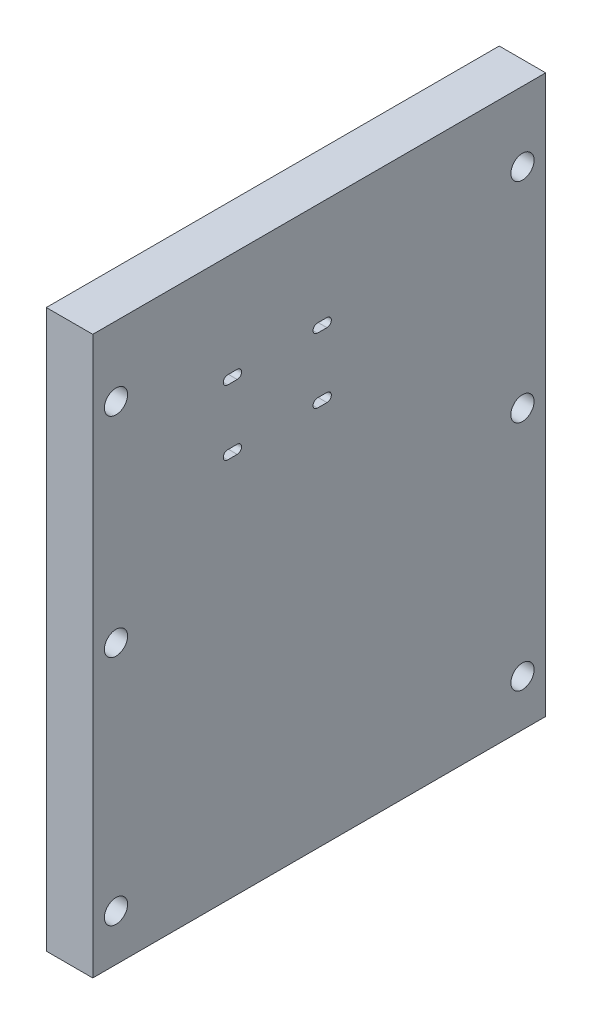
ISO-10303-21;
HEADER;
FILE_DESCRIPTION(('STEP AP214'),'2;1');
FILE_NAME('part.step','',(''),(''),'','','');
FILE_SCHEMA(('AUTOMOTIVE_DESIGN { 1 0 10303 214 1 1 1 1 }'));
ENDSEC;
DATA;
#1=APPLICATION_CONTEXT('core data for automotive mechanical design processes');
#2=APPLICATION_PROTOCOL_DEFINITION('international standard','automotive_design',2000,#1);
#3=PRODUCT_CONTEXT('',#1,'mechanical');
#4=PRODUCT('Part','Part','',(#3));
#5=PRODUCT_RELATED_PRODUCT_CATEGORY('part','',(#4));
#6=PRODUCT_DEFINITION_FORMATION('','',#4);
#7=PRODUCT_DEFINITION_CONTEXT('part definition',#1,'design');
#8=PRODUCT_DEFINITION('design','',#6,#7);
#9=PRODUCT_DEFINITION_SHAPE('','',#8);
#10=(LENGTH_UNIT() NAMED_UNIT(*) SI_UNIT(.MILLI.,.METRE.));
#11=(NAMED_UNIT(*) PLANE_ANGLE_UNIT() SI_UNIT($,.RADIAN.));
#12=(NAMED_UNIT(*) SI_UNIT($,.STERADIAN.) SOLID_ANGLE_UNIT());
#13=UNCERTAINTY_MEASURE_WITH_UNIT(LENGTH_MEASURE(1.E-05),#10,'distance_accuracy_value','');
#14=(GEOMETRIC_REPRESENTATION_CONTEXT(3) GLOBAL_UNCERTAINTY_ASSIGNED_CONTEXT((#13)) GLOBAL_UNIT_ASSIGNED_CONTEXT((#10,
#11,#12)) REPRESENTATION_CONTEXT('',''));
#15=CARTESIAN_POINT('',(0.,0.,0.));
#16=DIRECTION('',(0.,0.,1.));
#17=DIRECTION('',(1.,0.,0.));
#18=AXIS2_PLACEMENT_3D('',#15,#16,#17);
#19=CARTESIAN_POINT('',(12.7,46.97,-39.2012106466433));
#20=DIRECTION('',(-1.,0.,0.));
#21=DIRECTION('',(0.,0.,1.));
#22=AXIS2_PLACEMENT_3D('',#19,#20,#21);
#23=CYLINDRICAL_SURFACE('',#22,1.2);
#24=CARTESIAN_POINT('',(0.,46.97,-39.2012106466433));
#25=DIRECTION('',(1.,0.,0.));
#26=DIRECTION('',(0.,0.,-1.));
#27=AXIS2_PLACEMENT_3D('',#24,#25,#26);
#28=CIRCLE('',#27,1.2);
#29=CARTESIAN_POINT('',(0.,48.17,-39.2012106466433));
#30=VERTEX_POINT('',#29);
#31=CARTESIAN_POINT('',(0.,45.77,-39.2012106466433));
#32=VERTEX_POINT('',#31);
#33=EDGE_CURVE('E307',#30,#32,#28,.T.);
#34=ORIENTED_EDGE('',*,*,#33,.F.);
#35=DIRECTION('',(-1.,0.,0.));
#36=VECTOR('',#35,1.);
#37=CARTESIAN_POINT('',(12.7,48.17,-39.2012106466433));
#38=LINE('',#37,#36);
#39=CARTESIAN_POINT('',(12.7,48.17,-39.2012106466433));
#40=VERTEX_POINT('',#39);
#41=EDGE_CURVE('E11',#40,#30,#38,.T.);
#42=ORIENTED_EDGE('',*,*,#41,.F.);
#43=CARTESIAN_POINT('',(12.7,46.97,-39.2012106466433));
#44=DIRECTION('',(1.,0.,0.));
#45=DIRECTION('',(0.,0.,-1.));
#46=AXIS2_PLACEMENT_3D('',#43,#44,#45);
#47=CIRCLE('',#46,1.2);
#48=CARTESIAN_POINT('',(12.7,45.77,-39.2012106466433));
#49=VERTEX_POINT('',#48);
#50=EDGE_CURVE('E210',#40,#49,#47,.T.);
#51=ORIENTED_EDGE('',*,*,#50,.T.);
#52=DIRECTION('',(-1.,0.,0.));
#53=VECTOR('',#52,1.);
#54=CARTESIAN_POINT('',(12.7,45.77,-39.2012106466433));
#55=LINE('',#54,#53);
#56=EDGE_CURVE('E137',#49,#32,#55,.T.);
#57=ORIENTED_EDGE('',*,*,#56,.T.);
#58=EDGE_LOOP('',(#34,#42,#51,#57));
#59=FACE_BOUND('',#58,.T.);
#60=ADVANCED_FACE('F47',(#59),#23,.F.);
#61=CARTESIAN_POINT('',(12.7,48.17,0.));
#62=DIRECTION('',(0.,-1.,0.));
#63=DIRECTION('',(0.,0.,-1.));
#64=AXIS2_PLACEMENT_3D('',#61,#62,#63);
#65=PLANE('',#64);
#66=DIRECTION('',(0.,0.,1.));
#67=VECTOR('',#66,1.);
#68=CARTESIAN_POINT('',(0.,48.17,0.));
#69=LINE('',#68,#67);
#70=CARTESIAN_POINT('',(0.,48.17,-41.8012106466433));
#71=VERTEX_POINT('',#70);
#72=EDGE_CURVE('E201',#71,#30,#69,.T.);
#73=ORIENTED_EDGE('',*,*,#72,.F.);
#74=DIRECTION('',(-1.,0.,0.));
#75=VECTOR('',#74,1.);
#76=CARTESIAN_POINT('',(12.7,48.17,-41.8012106466433));
#77=LINE('',#76,#75);
#78=CARTESIAN_POINT('',(12.7,48.17,-41.8012106466433));
#79=VERTEX_POINT('',#78);
#80=EDGE_CURVE('E58',#79,#71,#77,.T.);
#81=ORIENTED_EDGE('',*,*,#80,.F.);
#82=DIRECTION('',(0.,0.,1.));
#83=VECTOR('',#82,1.);
#84=CARTESIAN_POINT('',(12.7,48.17,0.));
#85=LINE('',#84,#83);
#86=EDGE_CURVE('E199',#79,#40,#85,.T.);
#87=ORIENTED_EDGE('',*,*,#86,.T.);
#88=ORIENTED_EDGE('',*,*,#41,.T.);
#89=EDGE_LOOP('',(#73,#81,#87,#88));
#90=FACE_BOUND('',#89,.T.);
#91=ADVANCED_FACE('F198',(#90),#65,.T.);
#92=CARTESIAN_POINT('',(12.7,46.97,-41.8012106466433));
#93=DIRECTION('',(-1.,0.,0.));
#94=DIRECTION('',(0.,0.,1.));
#95=AXIS2_PLACEMENT_3D('',#92,#93,#94);
#96=CYLINDRICAL_SURFACE('',#95,1.2);
#97=CARTESIAN_POINT('',(0.,46.97,-41.8012106466433));
#98=DIRECTION('',(1.,0.,0.));
#99=DIRECTION('',(0.,0.,-1.));
#100=AXIS2_PLACEMENT_3D('',#97,#98,#99);
#101=CIRCLE('',#100,1.2);
#102=CARTESIAN_POINT('',(0.,45.77,-41.8012106466433));
#103=VERTEX_POINT('',#102);
#104=EDGE_CURVE('E313',#103,#71,#101,.T.);
#105=ORIENTED_EDGE('',*,*,#104,.F.);
#106=DIRECTION('',(-1.,0.,0.));
#107=VECTOR('',#106,1.);
#108=CARTESIAN_POINT('',(12.7,45.77,-41.8012106466433));
#109=LINE('',#108,#107);
#110=CARTESIAN_POINT('',(12.7,45.77,-41.8012106466433));
#111=VERTEX_POINT('',#110);
#112=EDGE_CURVE('E130',#111,#103,#109,.T.);
#113=ORIENTED_EDGE('',*,*,#112,.F.);
#114=CARTESIAN_POINT('',(12.7,46.97,-41.8012106466433));
#115=DIRECTION('',(1.,0.,0.));
#116=DIRECTION('',(0.,0.,-1.));
#117=AXIS2_PLACEMENT_3D('',#114,#115,#116);
#118=CIRCLE('',#117,1.2);
#119=EDGE_CURVE('E209',#111,#79,#118,.T.);
#120=ORIENTED_EDGE('',*,*,#119,.T.);
#121=ORIENTED_EDGE('',*,*,#80,.T.);
#122=EDGE_LOOP('',(#105,#113,#120,#121));
#123=FACE_BOUND('',#122,.T.);
#124=ADVANCED_FACE('F213',(#123),#96,.F.);
#125=CARTESIAN_POINT('',(12.7,30.43,0.));
#126=DIRECTION('',(0.,-1.,0.));
#127=DIRECTION('',(0.,0.,-1.));
#128=AXIS2_PLACEMENT_3D('',#125,#126,#127);
#129=PLANE('',#128);
#130=DIRECTION('',(0.,0.,1.));
#131=VECTOR('',#130,1.);
#132=CARTESIAN_POINT('',(0.,30.43,0.));
#133=LINE('',#132,#131);
#134=CARTESIAN_POINT('',(0.,30.43,-41.8012106466433));
#135=VERTEX_POINT('',#134);
#136=CARTESIAN_POINT('',(0.,30.43,-39.2012106466433));
#137=VERTEX_POINT('',#136);
#138=EDGE_CURVE('E291',#135,#137,#133,.T.);
#139=ORIENTED_EDGE('',*,*,#138,.F.);
#140=DIRECTION('',(-1.,0.,0.));
#141=VECTOR('',#140,1.);
#142=CARTESIAN_POINT('',(12.7,30.43,-41.8012106466433));
#143=LINE('',#142,#141);
#144=CARTESIAN_POINT('',(12.7,30.43,-41.8012106466433));
#145=VERTEX_POINT('',#144);
#146=EDGE_CURVE('E322',#145,#135,#143,.T.);
#147=ORIENTED_EDGE('',*,*,#146,.F.);
#148=DIRECTION('',(0.,0.,1.));
#149=VECTOR('',#148,1.);
#150=CARTESIAN_POINT('',(12.7,30.43,0.));
#151=LINE('',#150,#149);
#152=CARTESIAN_POINT('',(12.7,30.43,-39.2012106466433));
#153=VERTEX_POINT('',#152);
#154=EDGE_CURVE('E432',#145,#153,#151,.T.);
#155=ORIENTED_EDGE('',*,*,#154,.T.);
#156=DIRECTION('',(-1.,0.,0.));
#157=VECTOR('',#156,1.);
#158=CARTESIAN_POINT('',(12.7,30.43,-39.2012106466433));
#159=LINE('',#158,#157);
#160=EDGE_CURVE('E325',#153,#137,#159,.T.);
#161=ORIENTED_EDGE('',*,*,#160,.T.);
#162=EDGE_LOOP('',(#139,#147,#155,#161));
#163=FACE_BOUND('',#162,.T.);
#164=ADVANCED_FACE('F481',(#163),#129,.T.);
#165=CARTESIAN_POINT('',(12.7,29.23,-41.8012106466433));
#166=DIRECTION('',(-1.,0.,0.));
#167=DIRECTION('',(0.,0.,1.));
#168=AXIS2_PLACEMENT_3D('',#165,#166,#167);
#169=CYLINDRICAL_SURFACE('',#168,1.2);
#170=CARTESIAN_POINT('',(0.,29.23,-41.8012106466433));
#171=DIRECTION('',(1.,0.,0.));
#172=DIRECTION('',(0.,0.,-1.));
#173=AXIS2_PLACEMENT_3D('',#170,#171,#172);
#174=CIRCLE('',#173,1.2);
#175=CARTESIAN_POINT('',(0.,28.03,-41.8012106466433));
#176=VERTEX_POINT('',#175);
#177=EDGE_CURVE('E295',#135,#176,#174,.F.);
#178=ORIENTED_EDGE('',*,*,#177,.T.);
#179=DIRECTION('',(-1.,0.,0.));
#180=VECTOR('',#179,1.);
#181=CARTESIAN_POINT('',(12.7,28.03,-41.8012106466433));
#182=LINE('',#181,#180);
#183=CARTESIAN_POINT('',(12.7,28.03,-41.8012106466433));
#184=VERTEX_POINT('',#183);
#185=EDGE_CURVE('E333',#184,#176,#182,.T.);
#186=ORIENTED_EDGE('',*,*,#185,.F.);
#187=CARTESIAN_POINT('',(12.7,29.23,-41.8012106466433));
#188=DIRECTION('',(1.,0.,0.));
#189=DIRECTION('',(0.,0.,-1.));
#190=AXIS2_PLACEMENT_3D('',#187,#188,#189);
#191=CIRCLE('',#190,1.2);
#192=EDGE_CURVE('E436',#145,#184,#191,.F.);
#193=ORIENTED_EDGE('',*,*,#192,.F.);
#194=ORIENTED_EDGE('',*,*,#146,.T.);
#195=EDGE_LOOP('',(#178,#186,#193,#194));
#196=FACE_BOUND('',#195,.T.);
#197=ADVANCED_FACE('F477',(#196),#169,.F.);
#198=CARTESIAN_POINT('',(12.7,28.03,0.));
#199=DIRECTION('',(0.,-1.,0.));
#200=DIRECTION('',(0.,0.,-1.));
#201=AXIS2_PLACEMENT_3D('',#198,#199,#200);
#202=PLANE('',#201);
#203=DIRECTION('',(0.,0.,1.));
#204=VECTOR('',#203,1.);
#205=CARTESIAN_POINT('',(0.,28.03,0.));
#206=LINE('',#205,#204);
#207=CARTESIAN_POINT('',(0.,28.03,-39.2012106466433));
#208=VERTEX_POINT('',#207);
#209=EDGE_CURVE('E299',#176,#208,#206,.T.);
#210=ORIENTED_EDGE('',*,*,#209,.T.);
#211=DIRECTION('',(-1.,0.,0.));
#212=VECTOR('',#211,1.);
#213=CARTESIAN_POINT('',(12.7,28.03,-39.2012106466433));
#214=LINE('',#213,#212);
#215=CARTESIAN_POINT('',(12.7,28.03,-39.2012106466433));
#216=VERTEX_POINT('',#215);
#217=EDGE_CURVE('E328',#216,#208,#214,.T.);
#218=ORIENTED_EDGE('',*,*,#217,.F.);
#219=DIRECTION('',(0.,0.,1.));
#220=VECTOR('',#219,1.);
#221=CARTESIAN_POINT('',(12.7,28.03,0.));
#222=LINE('',#221,#220);
#223=EDGE_CURVE('E440',#184,#216,#222,.T.);
#224=ORIENTED_EDGE('',*,*,#223,.F.);
#225=ORIENTED_EDGE('',*,*,#185,.T.);
#226=EDGE_LOOP('',(#210,#218,#224,#225));
#227=FACE_BOUND('',#226,.T.);
#228=ADVANCED_FACE('F473',(#227),#202,.F.);
#229=CARTESIAN_POINT('',(12.7,45.77,0.));
#230=DIRECTION('',(0.,1.,0.));
#231=DIRECTION('',(0.,0.,1.));
#232=AXIS2_PLACEMENT_3D('',#229,#230,#231);
#233=PLANE('',#232);
#234=DIRECTION('',(0.,0.,-1.));
#235=VECTOR('',#234,1.);
#236=CARTESIAN_POINT('',(0.,45.77,0.));
#237=LINE('',#236,#235);
#238=CARTESIAN_POINT('',(0.,45.77,-14.6612106466434));
#239=VERTEX_POINT('',#238);
#240=CARTESIAN_POINT('',(0.,45.77,-17.2612106466434));
#241=VERTEX_POINT('',#240);
#242=EDGE_CURVE('E275',#239,#241,#237,.T.);
#243=ORIENTED_EDGE('',*,*,#242,.F.);
#244=DIRECTION('',(-1.,0.,0.));
#245=VECTOR('',#244,1.);
#246=CARTESIAN_POINT('',(12.7,45.77,-14.6612106466434));
#247=LINE('',#246,#245);
#248=CARTESIAN_POINT('',(12.7,45.77,-14.6612106466434));
#249=VERTEX_POINT('',#248);
#250=EDGE_CURVE('E329',#249,#239,#247,.T.);
#251=ORIENTED_EDGE('',*,*,#250,.F.);
#252=DIRECTION('',(0.,0.,-1.));
#253=VECTOR('',#252,1.);
#254=CARTESIAN_POINT('',(12.7,45.77,0.));
#255=LINE('',#254,#253);
#256=CARTESIAN_POINT('',(12.7,45.77,-17.2612106466434));
#257=VERTEX_POINT('',#256);
#258=EDGE_CURVE('E417',#249,#257,#255,.T.);
#259=ORIENTED_EDGE('',*,*,#258,.T.);
#260=DIRECTION('',(-1.,0.,0.));
#261=VECTOR('',#260,1.);
#262=CARTESIAN_POINT('',(12.7,45.77,-17.2612106466434));
#263=LINE('',#262,#261);
#264=EDGE_CURVE('E339',#257,#241,#263,.T.);
#265=ORIENTED_EDGE('',*,*,#264,.T.);
#266=EDGE_LOOP('',(#243,#251,#259,#265));
#267=FACE_BOUND('',#266,.T.);
#268=ADVANCED_FACE('F476',(#267),#233,.T.);
#269=CARTESIAN_POINT('',(12.7,46.97,-14.6612106466434));
#270=DIRECTION('',(-1.,0.,0.));
#271=DIRECTION('',(0.,0.,1.));
#272=AXIS2_PLACEMENT_3D('',#269,#270,#271);
#273=CYLINDRICAL_SURFACE('',#272,1.2);
#274=CARTESIAN_POINT('',(0.,46.97,-14.6612106466434));
#275=DIRECTION('',(1.,0.,0.));
#276=DIRECTION('',(0.,0.,-1.));
#277=AXIS2_PLACEMENT_3D('',#274,#275,#276);
#278=CIRCLE('',#277,1.2);
#279=CARTESIAN_POINT('',(0.,48.17,-14.6612106466434));
#280=VERTEX_POINT('',#279);
#281=EDGE_CURVE('E279',#239,#280,#278,.F.);
#282=ORIENTED_EDGE('',*,*,#281,.T.);
#283=DIRECTION('',(-1.,0.,0.));
#284=VECTOR('',#283,1.);
#285=CARTESIAN_POINT('',(12.7,48.17,-14.6612106466434));
#286=LINE('',#285,#284);
#287=CARTESIAN_POINT('',(12.7,48.17,-14.6612106466434));
#288=VERTEX_POINT('',#287);
#289=EDGE_CURVE('E347',#288,#280,#286,.T.);
#290=ORIENTED_EDGE('',*,*,#289,.F.);
#291=CARTESIAN_POINT('',(12.7,46.97,-14.6612106466434));
#292=DIRECTION('',(1.,0.,0.));
#293=DIRECTION('',(0.,0.,-1.));
#294=AXIS2_PLACEMENT_3D('',#291,#292,#293);
#295=CIRCLE('',#294,1.2);
#296=EDGE_CURVE('E421',#249,#288,#295,.F.);
#297=ORIENTED_EDGE('',*,*,#296,.F.);
#298=ORIENTED_EDGE('',*,*,#250,.T.);
#299=EDGE_LOOP('',(#282,#290,#297,#298));
#300=FACE_BOUND('',#299,.T.);
#301=ADVANCED_FACE('F494',(#300),#273,.F.);
#302=CARTESIAN_POINT('',(12.7,48.17,0.));
#303=DIRECTION('',(0.,1.,0.));
#304=DIRECTION('',(0.,0.,1.));
#305=AXIS2_PLACEMENT_3D('',#302,#303,#304);
#306=PLANE('',#305);
#307=DIRECTION('',(0.,0.,-1.));
#308=VECTOR('',#307,1.);
#309=CARTESIAN_POINT('',(0.,48.17,0.));
#310=LINE('',#309,#308);
#311=CARTESIAN_POINT('',(0.,48.17,-17.2612106466434));
#312=VERTEX_POINT('',#311);
#313=EDGE_CURVE('E283',#280,#312,#310,.T.);
#314=ORIENTED_EDGE('',*,*,#313,.T.);
#315=DIRECTION('',(-1.,0.,0.));
#316=VECTOR('',#315,1.);
#317=CARTESIAN_POINT('',(12.7,48.17,-17.2612106466434));
#318=LINE('',#317,#316);
#319=CARTESIAN_POINT('',(12.7,48.17,-17.2612106466434));
#320=VERTEX_POINT('',#319);
#321=EDGE_CURVE('E342',#320,#312,#318,.T.);
#322=ORIENTED_EDGE('',*,*,#321,.F.);
#323=DIRECTION('',(0.,0.,-1.));
#324=VECTOR('',#323,1.);
#325=CARTESIAN_POINT('',(12.7,48.17,0.));
#326=LINE('',#325,#324);
#327=EDGE_CURVE('E425',#288,#320,#326,.T.);
#328=ORIENTED_EDGE('',*,*,#327,.F.);
#329=ORIENTED_EDGE('',*,*,#289,.T.);
#330=EDGE_LOOP('',(#314,#322,#328,#329));
#331=FACE_BOUND('',#330,.T.);
#332=ADVANCED_FACE('F490',(#331),#306,.F.);
#333=CARTESIAN_POINT('',(12.7,29.23,-17.2612106466435));
#334=DIRECTION('',(-1.,0.,0.));
#335=DIRECTION('',(0.,0.,1.));
#336=AXIS2_PLACEMENT_3D('',#333,#334,#335);
#337=CYLINDRICAL_SURFACE('',#336,1.2);
#338=CARTESIAN_POINT('',(0.,29.23,-17.2612106466435));
#339=DIRECTION('',(1.,0.,0.));
#340=DIRECTION('',(0.,0.,-1.));
#341=AXIS2_PLACEMENT_3D('',#338,#339,#340);
#342=CIRCLE('',#341,1.2);
#343=CARTESIAN_POINT('',(0.,28.03,-17.2612106466434));
#344=VERTEX_POINT('',#343);
#345=CARTESIAN_POINT('',(0.,30.43,-17.2612106466434));
#346=VERTEX_POINT('',#345);
#347=EDGE_CURVE('E259',#344,#346,#342,.T.);
#348=ORIENTED_EDGE('',*,*,#347,.F.);
#349=DIRECTION('',(-1.,0.,0.));
#350=VECTOR('',#349,1.);
#351=CARTESIAN_POINT('',(12.7,28.03,-17.2612106466434));
#352=LINE('',#351,#350);
#353=CARTESIAN_POINT('',(12.7,28.03,-17.2612106466434));
#354=VERTEX_POINT('',#353);
#355=EDGE_CURVE('E343',#354,#344,#352,.T.);
#356=ORIENTED_EDGE('',*,*,#355,.F.);
#357=CARTESIAN_POINT('',(12.7,29.23,-17.2612106466435));
#358=DIRECTION('',(1.,0.,0.));
#359=DIRECTION('',(0.,0.,-1.));
#360=AXIS2_PLACEMENT_3D('',#357,#358,#359);
#361=CIRCLE('',#360,1.2);
#362=CARTESIAN_POINT('',(12.7,30.43,-17.2612106466434));
#363=VERTEX_POINT('',#362);
#364=EDGE_CURVE('E396',#354,#363,#361,.T.);
#365=ORIENTED_EDGE('',*,*,#364,.T.);
#366=DIRECTION('',(-1.,0.,0.));
#367=VECTOR('',#366,1.);
#368=CARTESIAN_POINT('',(12.7,30.43,-17.2612106466434));
#369=LINE('',#368,#367);
#370=EDGE_CURVE('E353',#363,#346,#369,.T.);
#371=ORIENTED_EDGE('',*,*,#370,.T.);
#372=EDGE_LOOP('',(#348,#356,#365,#371));
#373=FACE_BOUND('',#372,.T.);
#374=ADVANCED_FACE('F493',(#373),#337,.F.);
#375=CARTESIAN_POINT('',(12.7,28.03,0.));
#376=DIRECTION('',(0.,1.,0.));
#377=DIRECTION('',(0.,0.,1.));
#378=AXIS2_PLACEMENT_3D('',#375,#376,#377);
#379=PLANE('',#378);
#380=DIRECTION('',(0.,0.,-1.));
#381=VECTOR('',#380,1.);
#382=CARTESIAN_POINT('',(0.,28.03,0.));
#383=LINE('',#382,#381);
#384=CARTESIAN_POINT('',(0.,28.03,-14.6612106466434));
#385=VERTEX_POINT('',#384);
#386=EDGE_CURVE('E263',#385,#344,#383,.T.);
#387=ORIENTED_EDGE('',*,*,#386,.F.);
#388=DIRECTION('',(-1.,0.,0.));
#389=VECTOR('',#388,1.);
#390=CARTESIAN_POINT('',(12.7,28.03,-14.6612106466434));
#391=LINE('',#390,#389);
#392=CARTESIAN_POINT('',(12.7,28.03,-14.6612106466434));
#393=VERTEX_POINT('',#392);
#394=EDGE_CURVE('E359',#393,#385,#391,.T.);
#395=ORIENTED_EDGE('',*,*,#394,.F.);
#396=DIRECTION('',(0.,0.,-1.));
#397=VECTOR('',#396,1.);
#398=CARTESIAN_POINT('',(12.7,28.03,0.));
#399=LINE('',#398,#397);
#400=EDGE_CURVE('E402',#393,#354,#399,.T.);
#401=ORIENTED_EDGE('',*,*,#400,.T.);
#402=ORIENTED_EDGE('',*,*,#355,.T.);
#403=EDGE_LOOP('',(#387,#395,#401,#402));
#404=FACE_BOUND('',#403,.T.);
#405=ADVANCED_FACE('F508',(#404),#379,.T.);
#406=CARTESIAN_POINT('',(12.7,29.23,-14.6612106466434));
#407=DIRECTION('',(-1.,0.,0.));
#408=DIRECTION('',(0.,0.,1.));
#409=AXIS2_PLACEMENT_3D('',#406,#407,#408);
#410=CYLINDRICAL_SURFACE('',#409,1.2);
#411=CARTESIAN_POINT('',(0.,29.23,-14.6612106466434));
#412=DIRECTION('',(1.,0.,0.));
#413=DIRECTION('',(0.,0.,-1.));
#414=AXIS2_PLACEMENT_3D('',#411,#412,#413);
#415=CIRCLE('',#414,1.2);
#416=CARTESIAN_POINT('',(0.,30.43,-14.6612106466434));
#417=VERTEX_POINT('',#416);
#418=EDGE_CURVE('E267',#417,#385,#415,.T.);
#419=ORIENTED_EDGE('',*,*,#418,.F.);
#420=DIRECTION('',(-1.,0.,0.));
#421=VECTOR('',#420,1.);
#422=CARTESIAN_POINT('',(12.7,30.43,-14.6612106466434));
#423=LINE('',#422,#421);
#424=CARTESIAN_POINT('',(12.7,30.43,-14.6612106466434));
#425=VERTEX_POINT('',#424);
#426=EDGE_CURVE('E356',#425,#417,#423,.T.);
#427=ORIENTED_EDGE('',*,*,#426,.F.);
#428=CARTESIAN_POINT('',(12.7,29.23,-14.6612106466434));
#429=DIRECTION('',(1.,0.,0.));
#430=DIRECTION('',(0.,0.,-1.));
#431=AXIS2_PLACEMENT_3D('',#428,#429,#430);
#432=CIRCLE('',#431,1.2);
#433=EDGE_CURVE('E410',#425,#393,#432,.T.);
#434=ORIENTED_EDGE('',*,*,#433,.T.);
#435=ORIENTED_EDGE('',*,*,#394,.T.);
#436=EDGE_LOOP('',(#419,#427,#434,#435));
#437=FACE_BOUND('',#436,.T.);
#438=ADVANCED_FACE('F505',(#437),#410,.F.);
#439=CARTESIAN_POINT('',(12.7,0.,-101.6));
#440=DIRECTION('',(0.,0.,1.));
#441=DIRECTION('',(1.,0.,0.));
#442=AXIS2_PLACEMENT_3D('',#439,#440,#441);
#443=PLANE('',#442);
#444=DIRECTION('',(0.,1.,0.));
#445=VECTOR('',#444,1.);
#446=CARTESIAN_POINT('',(0.,0.,-101.6));
#447=LINE('',#446,#445);
#448=CARTESIAN_POINT('',(0.,-76.2,-101.6));
#449=VERTEX_POINT('',#448);
#450=CARTESIAN_POINT('',(0.,76.2,-101.6));
#451=VERTEX_POINT('',#450);
#452=EDGE_CURVE('E245',#449,#451,#447,.T.);
#453=ORIENTED_EDGE('',*,*,#452,.T.);
#454=DIRECTION('',(-1.,0.,0.));
#455=VECTOR('',#454,1.);
#456=CARTESIAN_POINT('',(12.7,76.2,-101.6));
#457=LINE('',#456,#455);
#458=CARTESIAN_POINT('',(12.7,76.2,-101.6));
#459=VERTEX_POINT('',#458);
#460=EDGE_CURVE('E51',#459,#451,#457,.T.);
#461=ORIENTED_EDGE('',*,*,#460,.F.);
#462=DIRECTION('',(0.,1.,0.));
#463=VECTOR('',#462,1.);
#464=CARTESIAN_POINT('',(12.7,0.,-101.6));
#465=LINE('',#464,#463);
#466=CARTESIAN_POINT('',(12.7,-76.2,-101.6));
#467=VERTEX_POINT('',#466);
#468=EDGE_CURVE('E145',#467,#459,#465,.T.);
#469=ORIENTED_EDGE('',*,*,#468,.F.);
#470=DIRECTION('',(-1.,0.,0.));
#471=VECTOR('',#470,1.);
#472=CARTESIAN_POINT('',(12.7,-76.2,-101.6));
#473=LINE('',#472,#471);
#474=EDGE_CURVE('E217',#467,#449,#473,.T.);
#475=ORIENTED_EDGE('',*,*,#474,.T.);
#476=EDGE_LOOP('',(#453,#461,#469,#475));
#477=FACE_BOUND('',#476,.T.);
#478=ADVANCED_FACE('F383',(#477),#443,.F.);
#479=CARTESIAN_POINT('',(12.7,76.2,0.));
#480=DIRECTION('',(0.,1.,0.));
#481=DIRECTION('',(0.,0.,1.));
#482=AXIS2_PLACEMENT_3D('',#479,#480,#481);
#483=PLANE('',#482);
#484=DIRECTION('',(0.,0.,-1.));
#485=VECTOR('',#484,1.);
#486=CARTESIAN_POINT('',(0.,76.2,0.));
#487=LINE('',#486,#485);
#488=CARTESIAN_POINT('',(0.,76.2,22.225));
#489=VERTEX_POINT('',#488);
#490=EDGE_CURVE('E249',#489,#451,#487,.T.);
#491=ORIENTED_EDGE('',*,*,#490,.F.);
#492=DIRECTION('',(-1.,0.,0.));
#493=VECTOR('',#492,1.);
#494=CARTESIAN_POINT('',(12.7,76.2,22.225));
#495=LINE('',#494,#493);
#496=CARTESIAN_POINT('',(12.7,76.2,22.225));
#497=VERTEX_POINT('',#496);
#498=EDGE_CURVE('E370',#497,#489,#495,.T.);
#499=ORIENTED_EDGE('',*,*,#498,.F.);
#500=DIRECTION('',(0.,0.,-1.));
#501=VECTOR('',#500,1.);
#502=CARTESIAN_POINT('',(12.7,76.2,0.));
#503=LINE('',#502,#501);
#504=EDGE_CURVE('E380',#497,#459,#503,.T.);
#505=ORIENTED_EDGE('',*,*,#504,.T.);
#506=ORIENTED_EDGE('',*,*,#460,.T.);
#507=EDGE_LOOP('',(#491,#499,#505,#506));
#508=FACE_BOUND('',#507,.T.);
#509=ADVANCED_FACE('F379',(#508),#483,.T.);
#510=CARTESIAN_POINT('',(12.7,0.,22.225));
#511=DIRECTION('',(0.,0.,-1.));
#512=DIRECTION('',(-1.,0.,0.));
#513=AXIS2_PLACEMENT_3D('',#510,#511,#512);
#514=PLANE('',#513);
#515=DIRECTION('',(0.,-1.,0.));
#516=VECTOR('',#515,1.);
#517=CARTESIAN_POINT('',(0.,0.,22.225));
#518=LINE('',#517,#516);
#519=CARTESIAN_POINT('',(0.,-76.2,22.225));
#520=VERTEX_POINT('',#519);
#521=EDGE_CURVE('E253',#489,#520,#518,.T.);
#522=ORIENTED_EDGE('',*,*,#521,.T.);
#523=DIRECTION('',(-1.,0.,0.));
#524=VECTOR('',#523,1.);
#525=CARTESIAN_POINT('',(12.7,-76.2,22.225));
#526=LINE('',#525,#524);
#527=CARTESIAN_POINT('',(12.7,-76.2,22.225));
#528=VERTEX_POINT('',#527);
#529=EDGE_CURVE('E367',#528,#520,#526,.T.);
#530=ORIENTED_EDGE('',*,*,#529,.F.);
#531=DIRECTION('',(0.,-1.,0.));
#532=VECTOR('',#531,1.);
#533=CARTESIAN_POINT('',(12.7,0.,22.225));
#534=LINE('',#533,#532);
#535=EDGE_CURVE('E397',#497,#528,#534,.T.);
#536=ORIENTED_EDGE('',*,*,#535,.F.);
#537=ORIENTED_EDGE('',*,*,#498,.T.);
#538=EDGE_LOOP('',(#522,#530,#536,#537));
#539=FACE_BOUND('',#538,.T.);
#540=ADVANCED_FACE('F390',(#539),#514,.F.);
#541=CARTESIAN_POINT('',(12.7,29.23,-39.2012106466432));
#542=DIRECTION('',(-1.,0.,0.));
#543=DIRECTION('',(0.,0.,1.));
#544=AXIS2_PLACEMENT_3D('',#541,#542,#543);
#545=CYLINDRICAL_SURFACE('',#544,1.2);
#546=CARTESIAN_POINT('',(0.,29.23,-39.2012106466432));
#547=DIRECTION('',(1.,0.,0.));
#548=DIRECTION('',(0.,0.,-1.));
#549=AXIS2_PLACEMENT_3D('',#546,#547,#548);
#550=CIRCLE('',#549,1.2);
#551=EDGE_CURVE('E303',#208,#137,#550,.F.);
#552=ORIENTED_EDGE('',*,*,#551,.T.);
#553=ORIENTED_EDGE('',*,*,#160,.F.);
#554=CARTESIAN_POINT('',(12.7,29.23,-39.2012106466432));
#555=DIRECTION('',(1.,0.,0.));
#556=DIRECTION('',(0.,0.,-1.));
#557=AXIS2_PLACEMENT_3D('',#554,#555,#556);
#558=CIRCLE('',#557,1.2);
#559=EDGE_CURVE('E444',#216,#153,#558,.F.);
#560=ORIENTED_EDGE('',*,*,#559,.F.);
#561=ORIENTED_EDGE('',*,*,#217,.T.);
#562=EDGE_LOOP('',(#552,#553,#560,#561));
#563=FACE_BOUND('',#562,.T.);
#564=ADVANCED_FACE('F468',(#563),#545,.F.);
#565=CARTESIAN_POINT('',(12.7,46.97,-17.2612106466434));
#566=DIRECTION('',(-1.,0.,0.));
#567=DIRECTION('',(0.,0.,1.));
#568=AXIS2_PLACEMENT_3D('',#565,#566,#567);
#569=CYLINDRICAL_SURFACE('',#568,1.2);
#570=CARTESIAN_POINT('',(0.,46.97,-17.2612106466434));
#571=DIRECTION('',(1.,0.,0.));
#572=DIRECTION('',(0.,0.,-1.));
#573=AXIS2_PLACEMENT_3D('',#570,#571,#572);
#574=CIRCLE('',#573,1.2);
#575=EDGE_CURVE('E287',#312,#241,#574,.F.);
#576=ORIENTED_EDGE('',*,*,#575,.T.);
#577=ORIENTED_EDGE('',*,*,#264,.F.);
#578=CARTESIAN_POINT('',(12.7,46.97,-17.2612106466434));
#579=DIRECTION('',(1.,0.,0.));
#580=DIRECTION('',(0.,0.,-1.));
#581=AXIS2_PLACEMENT_3D('',#578,#579,#580);
#582=CIRCLE('',#581,1.2);
#583=EDGE_CURVE('E429',#320,#257,#582,.F.);
#584=ORIENTED_EDGE('',*,*,#583,.F.);
#585=ORIENTED_EDGE('',*,*,#321,.T.);
#586=EDGE_LOOP('',(#576,#577,#584,#585));
#587=FACE_BOUND('',#586,.T.);
#588=ADVANCED_FACE('F471',(#587),#569,.F.);
#589=CARTESIAN_POINT('',(12.7,30.43,0.));
#590=DIRECTION('',(0.,1.,0.));
#591=DIRECTION('',(0.,0.,1.));
#592=AXIS2_PLACEMENT_3D('',#589,#590,#591);
#593=PLANE('',#592);
#594=DIRECTION('',(0.,0.,-1.));
#595=VECTOR('',#594,1.);
#596=CARTESIAN_POINT('',(0.,30.43,0.));
#597=LINE('',#596,#595);
#598=EDGE_CURVE('E271',#417,#346,#597,.T.);
#599=ORIENTED_EDGE('',*,*,#598,.T.);
#600=ORIENTED_EDGE('',*,*,#370,.F.);
#601=DIRECTION('',(0.,0.,-1.));
#602=VECTOR('',#601,1.);
#603=CARTESIAN_POINT('',(12.7,30.43,0.));
#604=LINE('',#603,#602);
#605=EDGE_CURVE('E414',#425,#363,#604,.T.);
#606=ORIENTED_EDGE('',*,*,#605,.F.);
#607=ORIENTED_EDGE('',*,*,#426,.T.);
#608=EDGE_LOOP('',(#599,#600,#606,#607));
#609=FACE_BOUND('',#608,.T.);
#610=ADVANCED_FACE('F488',(#609),#593,.F.);
#611=CARTESIAN_POINT('',(12.7,-76.2,0.));
#612=DIRECTION('',(0.,1.,0.));
#613=DIRECTION('',(0.,0.,1.));
#614=AXIS2_PLACEMENT_3D('',#611,#612,#613);
#615=PLANE('',#614);
#616=DIRECTION('',(0.,0.,-1.));
#617=VECTOR('',#616,1.);
#618=CARTESIAN_POINT('',(0.,-76.2,0.));
#619=LINE('',#618,#617);
#620=EDGE_CURVE('E256',#520,#449,#619,.T.);
#621=ORIENTED_EDGE('',*,*,#620,.T.);
#622=ORIENTED_EDGE('',*,*,#474,.F.);
#623=DIRECTION('',(0.,0.,-1.));
#624=VECTOR('',#623,1.);
#625=CARTESIAN_POINT('',(12.7,-76.2,0.));
#626=LINE('',#625,#624);
#627=EDGE_CURVE('E394',#528,#467,#626,.T.);
#628=ORIENTED_EDGE('',*,*,#627,.F.);
#629=ORIENTED_EDGE('',*,*,#529,.T.);
#630=EDGE_LOOP('',(#621,#622,#628,#629));
#631=FACE_BOUND('',#630,.T.);
#632=ADVANCED_FACE('F393',(#631),#615,.F.);
#633=CARTESIAN_POINT('',(12.7,-63.5,15.875));
#634=DIRECTION('',(-1.,0.,0.));
#635=DIRECTION('',(0.,0.,1.));
#636=AXIS2_PLACEMENT_3D('',#633,#634,#635);
#637=CYLINDRICAL_SURFACE('',#636,3.175);
#638=CARTESIAN_POINT('',(12.7,-63.5,15.875));
#639=DIRECTION('',(1.,0.,0.));
#640=DIRECTION('',(0.,0.,-1.));
#641=AXIS2_PLACEMENT_3D('',#638,#639,#640);
#642=CIRCLE('',#641,3.175);
#643=CARTESIAN_POINT('',(12.7,-63.5,12.7));
#644=VERTEX_POINT('',#643);
#645=EDGE_CURVE('E801',#644,#644,#642,.T.);
#646=ORIENTED_EDGE('',*,*,#645,.T.);
#647=EDGE_LOOP('',(#646));
#648=FACE_BOUND('',#647,.T.);
#649=CARTESIAN_POINT('',(0.,-63.5,15.875));
#650=DIRECTION('',(1.,0.,0.));
#651=DIRECTION('',(0.,0.,-1.));
#652=AXIS2_PLACEMENT_3D('',#649,#650,#651);
#653=CIRCLE('',#652,3.175);
#654=CARTESIAN_POINT('',(0.,-63.5,12.7));
#655=VERTEX_POINT('',#654);
#656=EDGE_CURVE('E241',#655,#655,#653,.T.);
#657=ORIENTED_EDGE('',*,*,#656,.F.);
#658=EDGE_LOOP('',(#657));
#659=FACE_BOUND('',#658,.T.);
#660=ADVANCED_FACE('F518',(#648,#659),#637,.F.);
#661=CARTESIAN_POINT('',(12.7,-63.5,-95.25));
#662=DIRECTION('',(-1.,0.,0.));
#663=DIRECTION('',(0.,0.,1.));
#664=AXIS2_PLACEMENT_3D('',#661,#662,#663);
#665=CYLINDRICAL_SURFACE('',#664,3.175);
#666=CARTESIAN_POINT('',(12.7,-63.5,-95.25));
#667=DIRECTION('',(1.,0.,0.));
#668=DIRECTION('',(0.,0.,-1.));
#669=AXIS2_PLACEMENT_3D('',#666,#667,#668);
#670=CIRCLE('',#669,3.175);
#671=CARTESIAN_POINT('',(12.7,-63.5,-98.425));
#672=VERTEX_POINT('',#671);
#673=EDGE_CURVE('E797',#672,#672,#670,.T.);
#674=ORIENTED_EDGE('',*,*,#673,.T.);
#675=EDGE_LOOP('',(#674));
#676=FACE_BOUND('',#675,.T.);
#677=CARTESIAN_POINT('',(0.,-63.5,-95.25));
#678=DIRECTION('',(1.,0.,0.));
#679=DIRECTION('',(0.,0.,-1.));
#680=AXIS2_PLACEMENT_3D('',#677,#678,#679);
#681=CIRCLE('',#680,3.175);
#682=CARTESIAN_POINT('',(0.,-63.5,-98.425));
#683=VERTEX_POINT('',#682);
#684=EDGE_CURVE('E237',#683,#683,#681,.T.);
#685=ORIENTED_EDGE('',*,*,#684,.F.);
#686=EDGE_LOOP('',(#685));
#687=FACE_BOUND('',#686,.T.);
#688=ADVANCED_FACE('F527',(#676,#687),#665,.F.);
#689=CARTESIAN_POINT('',(12.7,0.,15.875));
#690=DIRECTION('',(-1.,0.,0.));
#691=DIRECTION('',(0.,0.,1.));
#692=AXIS2_PLACEMENT_3D('',#689,#690,#691);
#693=CYLINDRICAL_SURFACE('',#692,3.175);
#694=CARTESIAN_POINT('',(12.7,0.,15.875));
#695=DIRECTION('',(1.,0.,0.));
#696=DIRECTION('',(0.,0.,-1.));
#697=AXIS2_PLACEMENT_3D('',#694,#695,#696);
#698=CIRCLE('',#697,3.175);
#699=CARTESIAN_POINT('',(12.7,0.,12.7));
#700=VERTEX_POINT('',#699);
#701=EDGE_CURVE('E789',#700,#700,#698,.T.);
#702=ORIENTED_EDGE('',*,*,#701,.T.);
#703=EDGE_LOOP('',(#702));
#704=FACE_BOUND('',#703,.T.);
#705=CARTESIAN_POINT('',(0.,0.,15.875));
#706=DIRECTION('',(1.,0.,0.));
#707=DIRECTION('',(0.,0.,-1.));
#708=AXIS2_PLACEMENT_3D('',#705,#706,#707);
#709=CIRCLE('',#708,3.175);
#710=CARTESIAN_POINT('',(0.,0.,12.7));
#711=VERTEX_POINT('',#710);
#712=EDGE_CURVE('E233',#711,#711,#709,.T.);
#713=ORIENTED_EDGE('',*,*,#712,.F.);
#714=EDGE_LOOP('',(#713));
#715=FACE_BOUND('',#714,.T.);
#716=ADVANCED_FACE('F531',(#704,#715),#693,.F.);
#717=CARTESIAN_POINT('',(12.7,57.15,15.875));
#718=DIRECTION('',(-1.,0.,0.));
#719=DIRECTION('',(0.,0.,1.));
#720=AXIS2_PLACEMENT_3D('',#717,#718,#719);
#721=CYLINDRICAL_SURFACE('',#720,3.175);
#722=CARTESIAN_POINT('',(12.7,57.15,15.875));
#723=DIRECTION('',(1.,0.,0.));
#724=DIRECTION('',(0.,0.,-1.));
#725=AXIS2_PLACEMENT_3D('',#722,#723,#724);
#726=CIRCLE('',#725,3.175);
#727=CARTESIAN_POINT('',(12.7,57.15,12.7));
#728=VERTEX_POINT('',#727);
#729=EDGE_CURVE('E784',#728,#728,#726,.T.);
#730=ORIENTED_EDGE('',*,*,#729,.T.);
#731=EDGE_LOOP('',(#730));
#732=FACE_BOUND('',#731,.T.);
#733=CARTESIAN_POINT('',(0.,57.15,15.875));
#734=DIRECTION('',(1.,0.,0.));
#735=DIRECTION('',(0.,0.,-1.));
#736=AXIS2_PLACEMENT_3D('',#733,#734,#735);
#737=CIRCLE('',#736,3.175);
#738=CARTESIAN_POINT('',(0.,57.15,12.7));
#739=VERTEX_POINT('',#738);
#740=EDGE_CURVE('E229',#739,#739,#737,.T.);
#741=ORIENTED_EDGE('',*,*,#740,.F.);
#742=EDGE_LOOP('',(#741));
#743=FACE_BOUND('',#742,.T.);
#744=ADVANCED_FACE('F535',(#732,#743),#721,.F.);
#745=CARTESIAN_POINT('',(12.7,0.,-95.25));
#746=DIRECTION('',(-1.,0.,0.));
#747=DIRECTION('',(0.,0.,1.));
#748=AXIS2_PLACEMENT_3D('',#745,#746,#747);
#749=CYLINDRICAL_SURFACE('',#748,3.175);
#750=CARTESIAN_POINT('',(12.7,0.,-95.25));
#751=DIRECTION('',(1.,0.,0.));
#752=DIRECTION('',(0.,0.,-1.));
#753=AXIS2_PLACEMENT_3D('',#750,#751,#752);
#754=CIRCLE('',#753,3.175);
#755=CARTESIAN_POINT('',(12.7,0.,-98.425));
#756=VERTEX_POINT('',#755);
#757=EDGE_CURVE('E546',#756,#756,#754,.T.);
#758=ORIENTED_EDGE('',*,*,#757,.T.);
#759=EDGE_LOOP('',(#758));
#760=FACE_BOUND('',#759,.T.);
#761=CARTESIAN_POINT('',(0.,0.,-95.25));
#762=DIRECTION('',(1.,0.,0.));
#763=DIRECTION('',(0.,0.,-1.));
#764=AXIS2_PLACEMENT_3D('',#761,#762,#763);
#765=CIRCLE('',#764,3.175);
#766=CARTESIAN_POINT('',(0.,0.,-98.425));
#767=VERTEX_POINT('',#766);
#768=EDGE_CURVE('E225',#767,#767,#765,.T.);
#769=ORIENTED_EDGE('',*,*,#768,.F.);
#770=EDGE_LOOP('',(#769));
#771=FACE_BOUND('',#770,.T.);
#772=ADVANCED_FACE('F457',(#760,#771),#749,.F.);
#773=CARTESIAN_POINT('',(12.7,57.15,-95.25));
#774=DIRECTION('',(-1.,0.,0.));
#775=DIRECTION('',(0.,0.,1.));
#776=AXIS2_PLACEMENT_3D('',#773,#774,#775);
#777=CYLINDRICAL_SURFACE('',#776,3.175);
#778=CARTESIAN_POINT('',(12.7,57.15,-95.25));
#779=DIRECTION('',(1.,0.,0.));
#780=DIRECTION('',(0.,0.,-1.));
#781=AXIS2_PLACEMENT_3D('',#778,#779,#780);
#782=CIRCLE('',#781,3.175);
#783=CARTESIAN_POINT('',(12.7,57.15,-98.425));
#784=VERTEX_POINT('',#783);
#785=EDGE_CURVE('E319',#784,#784,#782,.T.);
#786=ORIENTED_EDGE('',*,*,#785,.T.);
#787=EDGE_LOOP('',(#786));
#788=FACE_BOUND('',#787,.T.);
#789=CARTESIAN_POINT('',(0.,57.15,-95.25));
#790=DIRECTION('',(1.,0.,0.));
#791=DIRECTION('',(0.,0.,-1.));
#792=AXIS2_PLACEMENT_3D('',#789,#790,#791);
#793=CIRCLE('',#792,3.175);
#794=CARTESIAN_POINT('',(0.,57.15,-98.425));
#795=VERTEX_POINT('',#794);
#796=EDGE_CURVE('E221',#795,#795,#793,.T.);
#797=ORIENTED_EDGE('',*,*,#796,.F.);
#798=EDGE_LOOP('',(#797));
#799=FACE_BOUND('',#798,.T.);
#800=ADVANCED_FACE('F49',(#788,#799),#777,.F.);
#801=CARTESIAN_POINT('',(12.7,45.77,0.));
#802=DIRECTION('',(0.,-1.,0.));
#803=DIRECTION('',(0.,0.,-1.));
#804=AXIS2_PLACEMENT_3D('',#801,#802,#803);
#805=PLANE('',#804);
#806=DIRECTION('',(0.,0.,1.));
#807=VECTOR('',#806,1.);
#808=CARTESIAN_POINT('',(0.,45.77,0.));
#809=LINE('',#808,#807);
#810=EDGE_CURVE('E316',#103,#32,#809,.T.);
#811=ORIENTED_EDGE('',*,*,#810,.T.);
#812=ORIENTED_EDGE('',*,*,#56,.F.);
#813=DIRECTION('',(0.,0.,1.));
#814=VECTOR('',#813,1.);
#815=CARTESIAN_POINT('',(12.7,45.77,0.));
#816=LINE('',#815,#814);
#817=EDGE_CURVE('E67',#111,#49,#816,.T.);
#818=ORIENTED_EDGE('',*,*,#817,.F.);
#819=ORIENTED_EDGE('',*,*,#112,.T.);
#820=EDGE_LOOP('',(#811,#812,#818,#819));
#821=FACE_BOUND('',#820,.T.);
#822=ADVANCED_FACE('F448',(#821),#805,.F.);
#823=CARTESIAN_POINT('',(12.7,0.,0.));
#824=DIRECTION('',(1.,0.,0.));
#825=DIRECTION('',(0.,0.,-1.));
#826=AXIS2_PLACEMENT_3D('',#823,#824,#825);
#827=PLANE('',#826);
#828=ORIENTED_EDGE('',*,*,#785,.F.);
#829=EDGE_LOOP('',(#828));
#830=FACE_BOUND('',#829,.T.);
#831=ORIENTED_EDGE('',*,*,#757,.F.);
#832=EDGE_LOOP('',(#831));
#833=FACE_BOUND('',#832,.T.);
#834=ORIENTED_EDGE('',*,*,#729,.F.);
#835=EDGE_LOOP('',(#834));
#836=FACE_BOUND('',#835,.T.);
#837=ORIENTED_EDGE('',*,*,#701,.F.);
#838=EDGE_LOOP('',(#837));
#839=FACE_BOUND('',#838,.T.);
#840=ORIENTED_EDGE('',*,*,#673,.F.);
#841=EDGE_LOOP('',(#840));
#842=FACE_BOUND('',#841,.T.);
#843=ORIENTED_EDGE('',*,*,#645,.F.);
#844=EDGE_LOOP('',(#843));
#845=FACE_BOUND('',#844,.T.);
#846=ORIENTED_EDGE('',*,*,#468,.T.);
#847=ORIENTED_EDGE('',*,*,#504,.F.);
#848=ORIENTED_EDGE('',*,*,#535,.T.);
#849=ORIENTED_EDGE('',*,*,#627,.T.);
#850=EDGE_LOOP('',(#846,#847,#848,#849));
#851=FACE_BOUND('',#850,.T.);
#852=ORIENTED_EDGE('',*,*,#364,.F.);
#853=ORIENTED_EDGE('',*,*,#400,.F.);
#854=ORIENTED_EDGE('',*,*,#433,.F.);
#855=ORIENTED_EDGE('',*,*,#605,.T.);
#856=EDGE_LOOP('',(#852,#853,#854,#855));
#857=FACE_BOUND('',#856,.T.);
#858=ORIENTED_EDGE('',*,*,#258,.F.);
#859=ORIENTED_EDGE('',*,*,#296,.T.);
#860=ORIENTED_EDGE('',*,*,#327,.T.);
#861=ORIENTED_EDGE('',*,*,#583,.T.);
#862=EDGE_LOOP('',(#858,#859,#860,#861));
#863=FACE_BOUND('',#862,.T.);
#864=ORIENTED_EDGE('',*,*,#154,.F.);
#865=ORIENTED_EDGE('',*,*,#192,.T.);
#866=ORIENTED_EDGE('',*,*,#223,.T.);
#867=ORIENTED_EDGE('',*,*,#559,.T.);
#868=EDGE_LOOP('',(#864,#865,#866,#867));
#869=FACE_BOUND('',#868,.T.);
#870=ORIENTED_EDGE('',*,*,#50,.F.);
#871=ORIENTED_EDGE('',*,*,#86,.F.);
#872=ORIENTED_EDGE('',*,*,#119,.F.);
#873=ORIENTED_EDGE('',*,*,#817,.T.);
#874=EDGE_LOOP('',(#870,#871,#872,#873));
#875=FACE_BOUND('',#874,.T.);
#876=ADVANCED_FACE('F208',(#830,#833,#836,#839,#842,#845,#851,#857,#863,#869,#875),#827,.T.);
#877=CARTESIAN_POINT('',(0.,0.,0.));
#878=DIRECTION('',(1.,0.,0.));
#879=DIRECTION('',(0.,0.,-1.));
#880=AXIS2_PLACEMENT_3D('',#877,#878,#879);
#881=PLANE('',#880);
#882=ORIENTED_EDGE('',*,*,#796,.T.);
#883=EDGE_LOOP('',(#882));
#884=FACE_BOUND('',#883,.T.);
#885=ORIENTED_EDGE('',*,*,#768,.T.);
#886=EDGE_LOOP('',(#885));
#887=FACE_BOUND('',#886,.T.);
#888=ORIENTED_EDGE('',*,*,#740,.T.);
#889=EDGE_LOOP('',(#888));
#890=FACE_BOUND('',#889,.T.);
#891=ORIENTED_EDGE('',*,*,#712,.T.);
#892=EDGE_LOOP('',(#891));
#893=FACE_BOUND('',#892,.T.);
#894=ORIENTED_EDGE('',*,*,#684,.T.);
#895=EDGE_LOOP('',(#894));
#896=FACE_BOUND('',#895,.T.);
#897=ORIENTED_EDGE('',*,*,#656,.T.);
#898=EDGE_LOOP('',(#897));
#899=FACE_BOUND('',#898,.T.);
#900=ORIENTED_EDGE('',*,*,#452,.F.);
#901=ORIENTED_EDGE('',*,*,#620,.F.);
#902=ORIENTED_EDGE('',*,*,#521,.F.);
#903=ORIENTED_EDGE('',*,*,#490,.T.);
#904=EDGE_LOOP('',(#900,#901,#902,#903));
#905=FACE_BOUND('',#904,.T.);
#906=ORIENTED_EDGE('',*,*,#347,.T.);
#907=ORIENTED_EDGE('',*,*,#598,.F.);
#908=ORIENTED_EDGE('',*,*,#418,.T.);
#909=ORIENTED_EDGE('',*,*,#386,.T.);
#910=EDGE_LOOP('',(#906,#907,#908,#909));
#911=FACE_BOUND('',#910,.T.);
#912=ORIENTED_EDGE('',*,*,#242,.T.);
#913=ORIENTED_EDGE('',*,*,#575,.F.);
#914=ORIENTED_EDGE('',*,*,#313,.F.);
#915=ORIENTED_EDGE('',*,*,#281,.F.);
#916=EDGE_LOOP('',(#912,#913,#914,#915));
#917=FACE_BOUND('',#916,.T.);
#918=ORIENTED_EDGE('',*,*,#138,.T.);
#919=ORIENTED_EDGE('',*,*,#551,.F.);
#920=ORIENTED_EDGE('',*,*,#209,.F.);
#921=ORIENTED_EDGE('',*,*,#177,.F.);
#922=EDGE_LOOP('',(#918,#919,#920,#921));
#923=FACE_BOUND('',#922,.T.);
#924=ORIENTED_EDGE('',*,*,#33,.T.);
#925=ORIENTED_EDGE('',*,*,#810,.F.);
#926=ORIENTED_EDGE('',*,*,#104,.T.);
#927=ORIENTED_EDGE('',*,*,#72,.T.);
#928=EDGE_LOOP('',(#924,#925,#926,#927));
#929=FACE_BOUND('',#928,.T.);
#930=ADVANCED_FACE('F387',(#884,#887,#890,#893,#896,#899,#905,#911,#917,#923,#929),#881,.F.);
#931=CLOSED_SHELL('',(#60,#91,#124,#164,#197,#228,#268,#301,#332,#374,#405,#438,#478,#509,#540,
#564,#588,#610,#632,#660,#688,#716,#744,#772,#800,#822,#876,#930));
#932=MANIFOLD_SOLID_BREP('B2',#931);
#933=ADVANCED_BREP_SHAPE_REPRESENTATION('',(#18,#932),#14);
#934=SHAPE_DEFINITION_REPRESENTATION(#9,#933);
ENDSEC;
END-ISO-10303-21;
